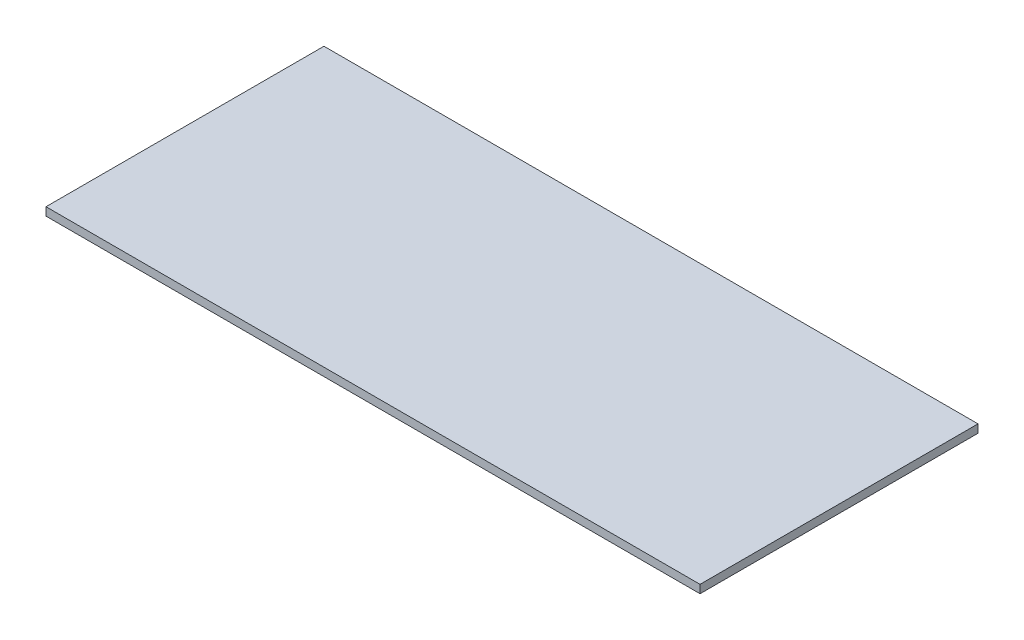
ISO-10303-21;
HEADER;
FILE_DESCRIPTION(('STEP AP214'),'2;1');
FILE_NAME('part.step','',(''),(''),'','','');
FILE_SCHEMA(('AUTOMOTIVE_DESIGN { 1 0 10303 214 1 1 1 1 }'));
ENDSEC;
DATA;
#1=APPLICATION_CONTEXT('core data for automotive mechanical design processes');
#2=APPLICATION_PROTOCOL_DEFINITION('international standard','automotive_design',2000,#1);
#3=PRODUCT_CONTEXT('',#1,'mechanical');
#4=PRODUCT('Part','Part','',(#3));
#5=PRODUCT_RELATED_PRODUCT_CATEGORY('part','',(#4));
#6=PRODUCT_DEFINITION_FORMATION('','',#4);
#7=PRODUCT_DEFINITION_CONTEXT('part definition',#1,'design');
#8=PRODUCT_DEFINITION('design','',#6,#7);
#9=PRODUCT_DEFINITION_SHAPE('','',#8);
#10=(LENGTH_UNIT() NAMED_UNIT(*) SI_UNIT(.MILLI.,.METRE.));
#11=(NAMED_UNIT(*) PLANE_ANGLE_UNIT() SI_UNIT($,.RADIAN.));
#12=(NAMED_UNIT(*) SI_UNIT($,.STERADIAN.) SOLID_ANGLE_UNIT());
#13=UNCERTAINTY_MEASURE_WITH_UNIT(LENGTH_MEASURE(1.E-05),#10,'distance_accuracy_value','');
#14=(GEOMETRIC_REPRESENTATION_CONTEXT(3) GLOBAL_UNCERTAINTY_ASSIGNED_CONTEXT((#13)) GLOBAL_UNIT_ASSIGNED_CONTEXT((#10,
#11,#12)) REPRESENTATION_CONTEXT('',''));
#15=CARTESIAN_POINT('',(0.,0.,0.));
#16=DIRECTION('',(0.,0.,1.));
#17=DIRECTION('',(1.,0.,0.));
#18=AXIS2_PLACEMENT_3D('',#15,#16,#17);
#19=CARTESIAN_POINT('',(254.,6.35,107.95));
#20=DIRECTION('',(-1.,0.,0.));
#21=DIRECTION('',(0.,0.,1.));
#22=AXIS2_PLACEMENT_3D('',#19,#20,#21);
#23=PLANE('',#22);
#24=DIRECTION('',(0.,0.,-1.));
#25=VECTOR('',#24,1.);
#26=CARTESIAN_POINT('',(254.,0.,107.95));
#27=LINE('',#26,#25);
#28=CARTESIAN_POINT('',(254.,0.,107.95));
#29=VERTEX_POINT('',#28);
#30=CARTESIAN_POINT('',(254.,0.,-107.95));
#31=VERTEX_POINT('',#30);
#32=EDGE_CURVE('E111',#29,#31,#27,.T.);
#33=ORIENTED_EDGE('',*,*,#32,.T.);
#34=DIRECTION('',(0.,-1.,0.));
#35=VECTOR('',#34,1.);
#36=CARTESIAN_POINT('',(254.,6.35,-107.95));
#37=LINE('',#36,#35);
#38=CARTESIAN_POINT('',(254.,6.35,-107.95));
#39=VERTEX_POINT('',#38);
#40=EDGE_CURVE('E11',#39,#31,#37,.T.);
#41=ORIENTED_EDGE('',*,*,#40,.F.);
#42=DIRECTION('',(0.,0.,-1.));
#43=VECTOR('',#42,1.);
#44=CARTESIAN_POINT('',(254.,6.35,107.95));
#45=LINE('',#44,#43);
#46=CARTESIAN_POINT('',(254.,6.35,107.95));
#47=VERTEX_POINT('',#46);
#48=EDGE_CURVE('E95',#47,#39,#45,.T.);
#49=ORIENTED_EDGE('',*,*,#48,.F.);
#50=DIRECTION('',(0.,-1.,0.));
#51=VECTOR('',#50,1.);
#52=CARTESIAN_POINT('',(254.,6.35,107.95));
#53=LINE('',#52,#51);
#54=EDGE_CURVE('E107',#47,#29,#53,.T.);
#55=ORIENTED_EDGE('',*,*,#54,.T.);
#56=EDGE_LOOP('',(#33,#41,#49,#55));
#57=FACE_BOUND('',#56,.T.);
#58=ADVANCED_FACE('F43',(#57),#23,.F.);
#59=CARTESIAN_POINT('',(-254.,6.35,-107.95));
#60=DIRECTION('',(0.,0.,1.));
#61=DIRECTION('',(1.,0.,0.));
#62=AXIS2_PLACEMENT_3D('',#59,#60,#61);
#63=PLANE('',#62);
#64=DIRECTION('',(-1.,0.,0.));
#65=VECTOR('',#64,1.);
#66=CARTESIAN_POINT('',(-254.,0.,-107.95));
#67=LINE('',#66,#65);
#68=CARTESIAN_POINT('',(-254.,0.,-107.95));
#69=VERTEX_POINT('',#68);
#70=EDGE_CURVE('E100',#31,#69,#67,.T.);
#71=ORIENTED_EDGE('',*,*,#70,.T.);
#72=DIRECTION('',(0.,-1.,0.));
#73=VECTOR('',#72,1.);
#74=CARTESIAN_POINT('',(-254.,6.35,-107.95));
#75=LINE('',#74,#73);
#76=CARTESIAN_POINT('',(-254.,6.35,-107.95));
#77=VERTEX_POINT('',#76);
#78=EDGE_CURVE('E52',#77,#69,#75,.T.);
#79=ORIENTED_EDGE('',*,*,#78,.F.);
#80=DIRECTION('',(-1.,0.,0.));
#81=VECTOR('',#80,1.);
#82=CARTESIAN_POINT('',(-254.,6.35,-107.95));
#83=LINE('',#82,#81);
#84=EDGE_CURVE('E90',#39,#77,#83,.T.);
#85=ORIENTED_EDGE('',*,*,#84,.F.);
#86=ORIENTED_EDGE('',*,*,#40,.T.);
#87=EDGE_LOOP('',(#71,#79,#85,#86));
#88=FACE_BOUND('',#87,.T.);
#89=ADVANCED_FACE('F99',(#88),#63,.F.);
#90=CARTESIAN_POINT('',(-254.,6.35,107.95));
#91=DIRECTION('',(1.,0.,0.));
#92=DIRECTION('',(0.,0.,-1.));
#93=AXIS2_PLACEMENT_3D('',#90,#91,#92);
#94=PLANE('',#93);
#95=DIRECTION('',(0.,0.,1.));
#96=VECTOR('',#95,1.);
#97=CARTESIAN_POINT('',(-254.,0.,107.95));
#98=LINE('',#97,#96);
#99=CARTESIAN_POINT('',(-254.,0.,107.95));
#100=VERTEX_POINT('',#99);
#101=EDGE_CURVE('E77',#69,#100,#98,.T.);
#102=ORIENTED_EDGE('',*,*,#101,.T.);
#103=DIRECTION('',(0.,-1.,0.));
#104=VECTOR('',#103,1.);
#105=CARTESIAN_POINT('',(-254.,6.35,107.95));
#106=LINE('',#105,#104);
#107=CARTESIAN_POINT('',(-254.,6.35,107.95));
#108=VERTEX_POINT('',#107);
#109=EDGE_CURVE('E102',#108,#100,#106,.T.);
#110=ORIENTED_EDGE('',*,*,#109,.F.);
#111=DIRECTION('',(0.,0.,1.));
#112=VECTOR('',#111,1.);
#113=CARTESIAN_POINT('',(-254.,6.35,107.95));
#114=LINE('',#113,#112);
#115=EDGE_CURVE('E93',#77,#108,#114,.T.);
#116=ORIENTED_EDGE('',*,*,#115,.F.);
#117=ORIENTED_EDGE('',*,*,#78,.T.);
#118=EDGE_LOOP('',(#102,#110,#116,#117));
#119=FACE_BOUND('',#118,.T.);
#120=ADVANCED_FACE('F103',(#119),#94,.F.);
#121=CARTESIAN_POINT('',(-254.,6.35,107.95));
#122=DIRECTION('',(0.,0.,-1.));
#123=DIRECTION('',(-1.,0.,0.));
#124=AXIS2_PLACEMENT_3D('',#121,#122,#123);
#125=PLANE('',#124);
#126=DIRECTION('',(1.,0.,0.));
#127=VECTOR('',#126,1.);
#128=CARTESIAN_POINT('',(-254.,0.,107.95));
#129=LINE('',#128,#127);
#130=EDGE_CURVE('E83',#100,#29,#129,.T.);
#131=ORIENTED_EDGE('',*,*,#130,.T.);
#132=ORIENTED_EDGE('',*,*,#54,.F.);
#133=DIRECTION('',(1.,0.,0.));
#134=VECTOR('',#133,1.);
#135=CARTESIAN_POINT('',(-254.,6.35,107.95));
#136=LINE('',#135,#134);
#137=EDGE_CURVE('E60',#108,#47,#136,.T.);
#138=ORIENTED_EDGE('',*,*,#137,.F.);
#139=ORIENTED_EDGE('',*,*,#109,.T.);
#140=EDGE_LOOP('',(#131,#132,#138,#139));
#141=FACE_BOUND('',#140,.T.);
#142=ADVANCED_FACE('F124',(#141),#125,.F.);
#143=CARTESIAN_POINT('',(0.,6.35,0.));
#144=DIRECTION('',(0.,-1.,0.));
#145=DIRECTION('',(0.,0.,-1.));
#146=AXIS2_PLACEMENT_3D('',#143,#144,#145);
#147=PLANE('',#146);
#148=ORIENTED_EDGE('',*,*,#48,.T.);
#149=ORIENTED_EDGE('',*,*,#84,.T.);
#150=ORIENTED_EDGE('',*,*,#115,.T.);
#151=ORIENTED_EDGE('',*,*,#137,.T.);
#152=EDGE_LOOP('',(#148,#149,#150,#151));
#153=FACE_BOUND('',#152,.T.);
#154=ADVANCED_FACE('F91',(#153),#147,.F.);
#155=CARTESIAN_POINT('',(0.,0.,0.));
#156=DIRECTION('',(0.,-1.,0.));
#157=DIRECTION('',(0.,0.,-1.));
#158=AXIS2_PLACEMENT_3D('',#155,#156,#157);
#159=PLANE('',#158);
#160=ORIENTED_EDGE('',*,*,#32,.F.);
#161=ORIENTED_EDGE('',*,*,#130,.F.);
#162=ORIENTED_EDGE('',*,*,#101,.F.);
#163=ORIENTED_EDGE('',*,*,#70,.F.);
#164=EDGE_LOOP('',(#160,#161,#162,#163));
#165=FACE_BOUND('',#164,.T.);
#166=ADVANCED_FACE('F127',(#165),#159,.T.);
#167=CLOSED_SHELL('',(#58,#89,#120,#142,#154,#166));
#168=MANIFOLD_SOLID_BREP('B2',#167);
#169=ADVANCED_BREP_SHAPE_REPRESENTATION('',(#18,#168),#14);
#170=SHAPE_DEFINITION_REPRESENTATION(#9,#169);
ENDSEC;
END-ISO-10303-21;
